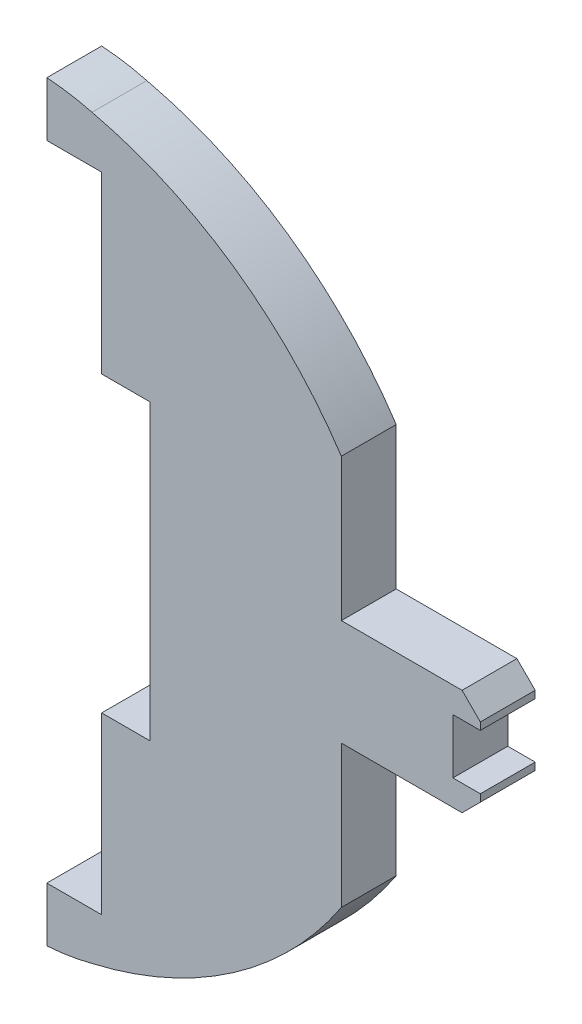
ISO-10303-21;
HEADER;
FILE_DESCRIPTION(('STEP AP214'),'2;1');
FILE_NAME('part.step','',(''),(''),'','','');
FILE_SCHEMA(('AUTOMOTIVE_DESIGN { 1 0 10303 214 1 1 1 1 }'));
ENDSEC;
DATA;
#1=APPLICATION_CONTEXT('core data for automotive mechanical design processes');
#2=APPLICATION_PROTOCOL_DEFINITION('international standard','automotive_design',2000,#1);
#3=PRODUCT_CONTEXT('',#1,'mechanical');
#4=PRODUCT('Part','Part','',(#3));
#5=PRODUCT_RELATED_PRODUCT_CATEGORY('part','',(#4));
#6=PRODUCT_DEFINITION_FORMATION('','',#4);
#7=PRODUCT_DEFINITION_CONTEXT('part definition',#1,'design');
#8=PRODUCT_DEFINITION('design','',#6,#7);
#9=PRODUCT_DEFINITION_SHAPE('','',#8);
#10=(LENGTH_UNIT() NAMED_UNIT(*) SI_UNIT(.MILLI.,.METRE.));
#11=(NAMED_UNIT(*) PLANE_ANGLE_UNIT() SI_UNIT($,.RADIAN.));
#12=(NAMED_UNIT(*) SI_UNIT($,.STERADIAN.) SOLID_ANGLE_UNIT());
#13=UNCERTAINTY_MEASURE_WITH_UNIT(LENGTH_MEASURE(1.E-05),#10,'distance_accuracy_value','');
#14=(GEOMETRIC_REPRESENTATION_CONTEXT(3) GLOBAL_UNCERTAINTY_ASSIGNED_CONTEXT((#13)) GLOBAL_UNIT_ASSIGNED_CONTEXT((#10,
#11,#12)) REPRESENTATION_CONTEXT('',''));
#15=CARTESIAN_POINT('',(0.,0.,0.));
#16=DIRECTION('',(0.,0.,1.));
#17=DIRECTION('',(1.,0.,0.));
#18=AXIS2_PLACEMENT_3D('',#15,#16,#17);
#19=CARTESIAN_POINT('',(19.5994373438194,155.602965815867,3.));
#20=DIRECTION('',(0.,0.,-1.));
#21=DIRECTION('',(-1.,0.,0.));
#22=AXIS2_PLACEMENT_3D('',#19,#20,#21);
#23=CYLINDRICAL_SURFACE('',#22,12.7681641595569);
#24=CARTESIAN_POINT('',(19.5994373438194,155.602965815867,3.));
#25=DIRECTION('',(0.,0.,1.));
#26=DIRECTION('',(1.,0.,0.));
#27=AXIS2_PLACEMENT_3D('',#24,#25,#26);
#28=CIRCLE('',#27,12.7681641595569);
#29=CARTESIAN_POINT('',(20.4107069246441,142.860601134513,3.));
#30=VERTEX_POINT('',#29);
#31=CARTESIAN_POINT('',(22.8824400958544,143.264087871114,3.));
#32=VERTEX_POINT('',#31);
#33=EDGE_CURVE('E235',#30,#32,#28,.T.);
#34=ORIENTED_EDGE('',*,*,#33,.F.);
#35=DIRECTION('',(0.,0.,-1.));
#36=VECTOR('',#35,1.);
#37=CARTESIAN_POINT('',(20.410706924644,142.860601134513,3.));
#38=LINE('',#37,#36);
#39=CARTESIAN_POINT('',(20.410706924644,142.860601134513,0.));
#40=VERTEX_POINT('',#39);
#41=EDGE_CURVE('E228',#30,#40,#38,.T.);
#42=ORIENTED_EDGE('',*,*,#41,.T.);
#43=CARTESIAN_POINT('',(19.5994373438194,155.602965815867,0.));
#44=DIRECTION('',(0.,0.,1.));
#45=DIRECTION('',(1.,0.,0.));
#46=AXIS2_PLACEMENT_3D('',#43,#44,#45);
#47=CIRCLE('',#46,12.7681641595569);
#48=CARTESIAN_POINT('',(22.8824400958544,143.264087871114,0.));
#49=VERTEX_POINT('',#48);
#50=EDGE_CURVE('E240',#40,#49,#47,.T.);
#51=ORIENTED_EDGE('',*,*,#50,.T.);
#52=DIRECTION('',(0.,0.,-1.));
#53=VECTOR('',#52,1.);
#54=CARTESIAN_POINT('',(22.8824400958544,143.264087871114,3.));
#55=LINE('',#54,#53);
#56=EDGE_CURVE('E338',#32,#49,#55,.T.);
#57=ORIENTED_EDGE('',*,*,#56,.F.);
#58=EDGE_LOOP('',(#34,#42,#51,#57));
#59=FACE_BOUND('',#58,.T.);
#60=ADVANCED_FACE('F38',(#59),#23,.T.);
#61=CARTESIAN_POINT('',(17.8149611137287,165.112045854795,3.));
#62=DIRECTION('',(0.,0.,-1.));
#63=DIRECTION('',(-1.,0.,0.));
#64=AXIS2_PLACEMENT_3D('',#61,#62,#63);
#65=CYLINDRICAL_SURFACE('',#64,22.42794264508);
#66=CARTESIAN_POINT('',(17.8149611137287,165.112045854795,0.));
#67=DIRECTION('',(0.,0.,1.));
#68=DIRECTION('',(1.,0.,0.));
#69=AXIS2_PLACEMENT_3D('',#66,#67,#68);
#70=CIRCLE('',#69,22.42794264508);
#71=CARTESIAN_POINT('',(36.517669154002,152.733785748816,0.));
#72=VERTEX_POINT('',#71);
#73=EDGE_CURVE('E248',#49,#72,#70,.T.);
#74=ORIENTED_EDGE('',*,*,#73,.T.);
#75=DIRECTION('',(0.,0.,-1.));
#76=VECTOR('',#75,1.);
#77=CARTESIAN_POINT('',(36.517669154002,152.733785748816,3.));
#78=LINE('',#77,#76);
#79=CARTESIAN_POINT('',(36.517669154002,152.733785748816,3.));
#80=VERTEX_POINT('',#79);
#81=EDGE_CURVE('E334',#80,#72,#78,.T.);
#82=ORIENTED_EDGE('',*,*,#81,.F.);
#83=CARTESIAN_POINT('',(17.8149611137287,165.112045854795,3.));
#84=DIRECTION('',(0.,0.,1.));
#85=DIRECTION('',(1.,0.,0.));
#86=AXIS2_PLACEMENT_3D('',#83,#84,#85);
#87=CIRCLE('',#86,22.42794264508);
#88=EDGE_CURVE('E394',#32,#80,#87,.T.);
#89=ORIENTED_EDGE('',*,*,#88,.F.);
#90=ORIENTED_EDGE('',*,*,#56,.T.);
#91=EDGE_LOOP('',(#74,#82,#89,#90));
#92=FACE_BOUND('',#91,.T.);
#93=ADVANCED_FACE('F444',(#92),#65,.T.);
#94=CARTESIAN_POINT('',(36.517669154002,157.325896202563,3.));
#95=DIRECTION('',(1.,0.,0.));
#96=DIRECTION('',(0.,0.,-1.));
#97=AXIS2_PLACEMENT_3D('',#94,#95,#96);
#98=PLANE('',#97);
#99=DIRECTION('',(0.,0.,1.));
#100=VECTOR('',#99,1.);
#101=CARTESIAN_POINT('',(36.517669154002,160.51800665631,-7.72787163454467));
#102=LINE('',#101,#100);
#103=CARTESIAN_POINT('',(36.517669154002,160.51800665631,0.));
#104=VERTEX_POINT('',#103);
#105=CARTESIAN_POINT('',(36.517669154002,160.51800665631,3.));
#106=VERTEX_POINT('',#105);
#107=EDGE_CURVE('E450',#104,#106,#102,.T.);
#108=ORIENTED_EDGE('',*,*,#107,.T.);
#109=DIRECTION('',(0.,-1.,0.));
#110=VECTOR('',#109,1.);
#111=CARTESIAN_POINT('',(36.517669154002,157.325896202563,3.));
#112=LINE('',#111,#110);
#113=EDGE_CURVE('E398',#106,#80,#112,.T.);
#114=ORIENTED_EDGE('',*,*,#113,.T.);
#115=ORIENTED_EDGE('',*,*,#81,.T.);
#116=DIRECTION('',(0.,-1.,0.));
#117=VECTOR('',#116,1.);
#118=CARTESIAN_POINT('',(36.517669154002,157.325896202563,0.));
#119=LINE('',#118,#117);
#120=EDGE_CURVE('E256',#104,#72,#119,.T.);
#121=ORIENTED_EDGE('',*,*,#120,.F.);
#122=EDGE_LOOP('',(#108,#114,#115,#121));
#123=FACE_BOUND('',#122,.T.);
#124=ADVANCED_FACE('F448',(#123),#98,.T.);
#125=CARTESIAN_POINT('',(36.517669154002,169.510117110058,3.));
#126=DIRECTION('',(-1.,0.,0.));
#127=DIRECTION('',(0.,0.,1.));
#128=AXIS2_PLACEMENT_3D('',#125,#126,#127);
#129=PLANE('',#128);
#130=DIRECTION('',(0.,1.,0.));
#131=VECTOR('',#130,1.);
#132=CARTESIAN_POINT('',(36.517669154002,169.510117110058,3.));
#133=LINE('',#132,#131);
#134=CARTESIAN_POINT('',(36.517669154002,166.318006656311,3.));
#135=VERTEX_POINT('',#134);
#136=CARTESIAN_POINT('',(36.517669154002,174.102227563806,3.));
#137=VERTEX_POINT('',#136);
#138=EDGE_CURVE('E400',#135,#137,#133,.T.);
#139=ORIENTED_EDGE('',*,*,#138,.F.);
#140=DIRECTION('',(0.,0.,1.));
#141=VECTOR('',#140,1.);
#142=CARTESIAN_POINT('',(36.517669154002,166.318006656311,-7.72787163454467));
#143=LINE('',#142,#141);
#144=CARTESIAN_POINT('',(36.517669154002,166.318006656311,0.));
#145=VERTEX_POINT('',#144);
#146=EDGE_CURVE('E376',#145,#135,#143,.T.);
#147=ORIENTED_EDGE('',*,*,#146,.F.);
#148=DIRECTION('',(0.,1.,0.));
#149=VECTOR('',#148,1.);
#150=CARTESIAN_POINT('',(36.517669154002,169.510117110058,0.));
#151=LINE('',#150,#149);
#152=CARTESIAN_POINT('',(36.517669154002,174.102227563806,0.));
#153=VERTEX_POINT('',#152);
#154=EDGE_CURVE('E267',#145,#153,#151,.T.);
#155=ORIENTED_EDGE('',*,*,#154,.T.);
#156=DIRECTION('',(0.,0.,-1.));
#157=VECTOR('',#156,1.);
#158=CARTESIAN_POINT('',(36.517669154002,174.102227563806,3.));
#159=LINE('',#158,#157);
#160=EDGE_CURVE('E330',#137,#153,#159,.T.);
#161=ORIENTED_EDGE('',*,*,#160,.F.);
#162=EDGE_LOOP('',(#139,#147,#155,#161));
#163=FACE_BOUND('',#162,.T.);
#164=ADVANCED_FACE('F480',(#163),#129,.F.);
#165=CARTESIAN_POINT('',(17.8149611137289,161.723967457826,3.));
#166=DIRECTION('',(0.,0.,-1.));
#167=DIRECTION('',(-1.,0.,0.));
#168=AXIS2_PLACEMENT_3D('',#165,#166,#167);
#169=CYLINDRICAL_SURFACE('',#168,22.4279426450797);
#170=CARTESIAN_POINT('',(17.8149611137289,161.723967457826,0.));
#171=DIRECTION('',(0.,0.,-1.));
#172=DIRECTION('',(1.,0.,0.));
#173=AXIS2_PLACEMENT_3D('',#170,#171,#172);
#174=CIRCLE('',#173,22.4279426450797);
#175=CARTESIAN_POINT('',(22.8824400958544,183.571925441507,0.));
#176=VERTEX_POINT('',#175);
#177=EDGE_CURVE('E270',#176,#153,#174,.T.);
#178=ORIENTED_EDGE('',*,*,#177,.F.);
#179=DIRECTION('',(0.,0.,-1.));
#180=VECTOR('',#179,1.);
#181=CARTESIAN_POINT('',(22.8824400958544,183.571925441507,3.));
#182=LINE('',#181,#180);
#183=CARTESIAN_POINT('',(22.8824400958544,183.571925441507,3.));
#184=VERTEX_POINT('',#183);
#185=EDGE_CURVE('E326',#184,#176,#182,.T.);
#186=ORIENTED_EDGE('',*,*,#185,.F.);
#187=CARTESIAN_POINT('',(17.8149611137289,161.723967457826,3.));
#188=DIRECTION('',(0.,0.,-1.));
#189=DIRECTION('',(1.,0.,0.));
#190=AXIS2_PLACEMENT_3D('',#187,#188,#189);
#191=CIRCLE('',#190,22.4279426450797);
#192=EDGE_CURVE('E403',#184,#137,#191,.T.);
#193=ORIENTED_EDGE('',*,*,#192,.T.);
#194=ORIENTED_EDGE('',*,*,#160,.T.);
#195=EDGE_LOOP('',(#178,#186,#193,#194));
#196=FACE_BOUND('',#195,.T.);
#197=ADVANCED_FACE('F484',(#196),#169,.T.);
#198=CARTESIAN_POINT('',(19.5994373438194,171.233047496754,3.));
#199=DIRECTION('',(0.,0.,-1.));
#200=DIRECTION('',(-1.,0.,0.));
#201=AXIS2_PLACEMENT_3D('',#198,#199,#200);
#202=CYLINDRICAL_SURFACE('',#201,12.7681641595569);
#203=DIRECTION('',(0.,0.,-1.));
#204=VECTOR('',#203,1.);
#205=CARTESIAN_POINT('',(20.410706924644,183.975412178108,3.));
#206=LINE('',#205,#204);
#207=CARTESIAN_POINT('',(20.4107069246441,183.975412178108,3.));
#208=VERTEX_POINT('',#207);
#209=CARTESIAN_POINT('',(20.4107069246441,183.975412178108,0.));
#210=VERTEX_POINT('',#209);
#211=EDGE_CURVE('E243',#208,#210,#206,.T.);
#212=ORIENTED_EDGE('',*,*,#211,.F.);
#213=CARTESIAN_POINT('',(19.5994373438194,171.233047496754,3.));
#214=DIRECTION('',(0.,0.,-1.));
#215=DIRECTION('',(1.,0.,0.));
#216=AXIS2_PLACEMENT_3D('',#213,#214,#215);
#217=CIRCLE('',#216,12.7681641595569);
#218=EDGE_CURVE('E407',#208,#184,#217,.T.);
#219=ORIENTED_EDGE('',*,*,#218,.T.);
#220=ORIENTED_EDGE('',*,*,#185,.T.);
#221=CARTESIAN_POINT('',(19.5994373438194,171.233047496754,0.));
#222=DIRECTION('',(0.,0.,-1.));
#223=DIRECTION('',(1.,0.,0.));
#224=AXIS2_PLACEMENT_3D('',#221,#222,#223);
#225=CIRCLE('',#224,12.7681641595569);
#226=EDGE_CURVE('E274',#210,#176,#225,.T.);
#227=ORIENTED_EDGE('',*,*,#226,.F.);
#228=EDGE_LOOP('',(#212,#219,#220,#227));
#229=FACE_BOUND('',#228,.T.);
#230=ADVANCED_FACE('F488',(#229),#202,.T.);
#231=CARTESIAN_POINT('',(20.410706924644,181.639203910361,3.));
#232=DIRECTION('',(-1.,0.,0.));
#233=DIRECTION('',(0.,0.,1.));
#234=AXIS2_PLACEMENT_3D('',#231,#232,#233);
#235=PLANE('',#234);
#236=DIRECTION('',(0.,1.,0.));
#237=VECTOR('',#236,1.);
#238=CARTESIAN_POINT('',(20.410706924644,181.639203910361,0.));
#239=LINE('',#238,#237);
#240=CARTESIAN_POINT('',(20.410706924644,181.00121165631,0.));
#241=VERTEX_POINT('',#240);
#242=EDGE_CURVE('E53',#241,#210,#239,.T.);
#243=ORIENTED_EDGE('',*,*,#242,.F.);
#244=DIRECTION('',(0.,0.,-1.));
#245=VECTOR('',#244,1.);
#246=CARTESIAN_POINT('',(20.410706924644,181.00121165631,3.));
#247=LINE('',#246,#245);
#248=CARTESIAN_POINT('',(20.410706924644,181.00121165631,3.));
#249=VERTEX_POINT('',#248);
#250=EDGE_CURVE('E323',#249,#241,#247,.T.);
#251=ORIENTED_EDGE('',*,*,#250,.F.);
#252=DIRECTION('',(0.,1.,0.));
#253=VECTOR('',#252,1.);
#254=CARTESIAN_POINT('',(20.410706924644,181.639203910361,3.));
#255=LINE('',#254,#253);
#256=EDGE_CURVE('E410',#249,#208,#255,.T.);
#257=ORIENTED_EDGE('',*,*,#256,.T.);
#258=ORIENTED_EDGE('',*,*,#211,.T.);
#259=EDGE_LOOP('',(#243,#251,#257,#258));
#260=FACE_BOUND('',#259,.T.);
#261=ADVANCED_FACE('F558',(#260),#235,.T.);
#262=CARTESIAN_POINT('',(21.910706924644,181.00121165631,3.));
#263=DIRECTION('',(0.,-1.,0.));
#264=DIRECTION('',(0.,0.,-1.));
#265=AXIS2_PLACEMENT_3D('',#262,#263,#264);
#266=PLANE('',#265);
#267=DIRECTION('',(-1.,0.,0.));
#268=VECTOR('',#267,1.);
#269=CARTESIAN_POINT('',(21.910706924644,181.00121165631,0.));
#270=LINE('',#269,#268);
#271=CARTESIAN_POINT('',(23.4107069246441,181.00121165631,0.));
#272=VERTEX_POINT('',#271);
#273=EDGE_CURVE('E278',#272,#241,#270,.T.);
#274=ORIENTED_EDGE('',*,*,#273,.F.);
#275=DIRECTION('',(0.,0.,-1.));
#276=VECTOR('',#275,1.);
#277=CARTESIAN_POINT('',(23.4107069246441,181.00121165631,3.));
#278=LINE('',#277,#276);
#279=CARTESIAN_POINT('',(23.4107069246441,181.00121165631,3.));
#280=VERTEX_POINT('',#279);
#281=EDGE_CURVE('E320',#280,#272,#278,.T.);
#282=ORIENTED_EDGE('',*,*,#281,.F.);
#283=DIRECTION('',(-1.,0.,0.));
#284=VECTOR('',#283,1.);
#285=CARTESIAN_POINT('',(21.910706924644,181.00121165631,3.));
#286=LINE('',#285,#284);
#287=EDGE_CURVE('E413',#280,#249,#286,.T.);
#288=ORIENTED_EDGE('',*,*,#287,.T.);
#289=ORIENTED_EDGE('',*,*,#250,.T.);
#290=EDGE_LOOP('',(#274,#282,#288,#289));
#291=FACE_BOUND('',#290,.T.);
#292=ADVANCED_FACE('F495',(#291),#266,.T.);
#293=CARTESIAN_POINT('',(23.4107069246441,176.221740571835,3.));
#294=DIRECTION('',(-1.,0.,0.));
#295=DIRECTION('',(0.,-1.,0.));
#296=AXIS2_PLACEMENT_3D('',#293,#294,#295);
#297=PLANE('',#296);
#298=DIRECTION('',(0.,1.,0.));
#299=VECTOR('',#298,1.);
#300=CARTESIAN_POINT('',(23.4107069246441,176.221740571835,0.));
#301=LINE('',#300,#299);
#302=CARTESIAN_POINT('',(23.4107069246441,171.44226948736,0.));
#303=VERTEX_POINT('',#302);
#304=EDGE_CURVE('E281',#303,#272,#301,.T.);
#305=ORIENTED_EDGE('',*,*,#304,.F.);
#306=DIRECTION('',(0.,0.,-1.));
#307=VECTOR('',#306,1.);
#308=CARTESIAN_POINT('',(23.4107069246441,171.44226948736,3.));
#309=LINE('',#308,#307);
#310=CARTESIAN_POINT('',(23.4107069246441,171.44226948736,3.));
#311=VERTEX_POINT('',#310);
#312=EDGE_CURVE('E317',#311,#303,#309,.T.);
#313=ORIENTED_EDGE('',*,*,#312,.F.);
#314=DIRECTION('',(0.,1.,0.));
#315=VECTOR('',#314,1.);
#316=CARTESIAN_POINT('',(23.4107069246441,176.221740571835,3.));
#317=LINE('',#316,#315);
#318=EDGE_CURVE('E417',#311,#280,#317,.T.);
#319=ORIENTED_EDGE('',*,*,#318,.T.);
#320=ORIENTED_EDGE('',*,*,#281,.T.);
#321=EDGE_LOOP('',(#305,#313,#319,#320));
#322=FACE_BOUND('',#321,.T.);
#323=ADVANCED_FACE('F498',(#322),#297,.T.);
#324=CARTESIAN_POINT('',(24.7319479659402,171.44226948736,3.));
#325=DIRECTION('',(0.,-1.,0.));
#326=DIRECTION('',(0.,0.,-1.));
#327=AXIS2_PLACEMENT_3D('',#324,#325,#326);
#328=PLANE('',#327);
#329=DIRECTION('',(-1.,0.,0.));
#330=VECTOR('',#329,1.);
#331=CARTESIAN_POINT('',(24.7319479659402,171.44226948736,0.));
#332=LINE('',#331,#330);
#333=CARTESIAN_POINT('',(26.0531890072364,171.44226948736,0.));
#334=VERTEX_POINT('',#333);
#335=EDGE_CURVE('E285',#334,#303,#332,.T.);
#336=ORIENTED_EDGE('',*,*,#335,.F.);
#337=DIRECTION('',(0.,0.,-1.));
#338=VECTOR('',#337,1.);
#339=CARTESIAN_POINT('',(26.0531890072364,171.44226948736,3.));
#340=LINE('',#339,#338);
#341=CARTESIAN_POINT('',(26.0531890072364,171.44226948736,3.));
#342=VERTEX_POINT('',#341);
#343=EDGE_CURVE('E314',#342,#334,#340,.T.);
#344=ORIENTED_EDGE('',*,*,#343,.F.);
#345=DIRECTION('',(-1.,0.,0.));
#346=VECTOR('',#345,1.);
#347=CARTESIAN_POINT('',(24.7319479659402,171.44226948736,3.));
#348=LINE('',#347,#346);
#349=EDGE_CURVE('E421',#342,#311,#348,.T.);
#350=ORIENTED_EDGE('',*,*,#349,.T.);
#351=ORIENTED_EDGE('',*,*,#312,.T.);
#352=EDGE_LOOP('',(#336,#344,#350,#351));
#353=FACE_BOUND('',#352,.T.);
#354=ADVANCED_FACE('F503',(#353),#328,.T.);
#355=CARTESIAN_POINT('',(26.0531890072364,167.430138071835,3.));
#356=DIRECTION('',(-1.,0.,0.));
#357=DIRECTION('',(0.,0.,1.));
#358=AXIS2_PLACEMENT_3D('',#355,#356,#357);
#359=PLANE('',#358);
#360=DIRECTION('',(0.,1.,0.));
#361=VECTOR('',#360,1.);
#362=CARTESIAN_POINT('',(26.0531890072364,167.430138071835,0.));
#363=LINE('',#362,#361);
#364=CARTESIAN_POINT('',(26.0531890072364,155.393743825262,0.));
#365=VERTEX_POINT('',#364);
#366=EDGE_CURVE('E289',#365,#334,#363,.T.);
#367=ORIENTED_EDGE('',*,*,#366,.F.);
#368=DIRECTION('',(0.,0.,-1.));
#369=VECTOR('',#368,1.);
#370=CARTESIAN_POINT('',(26.0531890072364,155.393743825262,3.));
#371=LINE('',#370,#369);
#372=CARTESIAN_POINT('',(26.0531890072364,155.393743825262,3.));
#373=VERTEX_POINT('',#372);
#374=EDGE_CURVE('E311',#373,#365,#371,.T.);
#375=ORIENTED_EDGE('',*,*,#374,.F.);
#376=DIRECTION('',(0.,1.,0.));
#377=VECTOR('',#376,1.);
#378=CARTESIAN_POINT('',(26.0531890072364,167.430138071835,3.));
#379=LINE('',#378,#377);
#380=EDGE_CURVE('E425',#373,#342,#379,.T.);
#381=ORIENTED_EDGE('',*,*,#380,.T.);
#382=ORIENTED_EDGE('',*,*,#343,.T.);
#383=EDGE_LOOP('',(#367,#375,#381,#382));
#384=FACE_BOUND('',#383,.T.);
#385=ADVANCED_FACE('F506',(#384),#359,.T.);
#386=CARTESIAN_POINT('',(24.7319479659402,155.393743825262,3.));
#387=DIRECTION('',(0.,-1.,0.));
#388=DIRECTION('',(0.,0.,-1.));
#389=AXIS2_PLACEMENT_3D('',#386,#387,#388);
#390=PLANE('',#389);
#391=DIRECTION('',(-1.,0.,0.));
#392=VECTOR('',#391,1.);
#393=CARTESIAN_POINT('',(24.7319479659402,155.393743825262,0.));
#394=LINE('',#393,#392);
#395=CARTESIAN_POINT('',(23.4107069246441,155.393743825262,0.));
#396=VERTEX_POINT('',#395);
#397=EDGE_CURVE('E293',#365,#396,#394,.T.);
#398=ORIENTED_EDGE('',*,*,#397,.T.);
#399=DIRECTION('',(0.,0.,-1.));
#400=VECTOR('',#399,1.);
#401=CARTESIAN_POINT('',(23.4107069246441,155.393743825262,3.));
#402=LINE('',#401,#400);
#403=CARTESIAN_POINT('',(23.4107069246441,155.393743825262,3.));
#404=VERTEX_POINT('',#403);
#405=EDGE_CURVE('E307',#404,#396,#402,.T.);
#406=ORIENTED_EDGE('',*,*,#405,.F.);
#407=DIRECTION('',(-1.,0.,0.));
#408=VECTOR('',#407,1.);
#409=CARTESIAN_POINT('',(24.7319479659402,155.393743825262,3.));
#410=LINE('',#409,#408);
#411=EDGE_CURVE('E429',#373,#404,#410,.T.);
#412=ORIENTED_EDGE('',*,*,#411,.F.);
#413=ORIENTED_EDGE('',*,*,#374,.T.);
#414=EDGE_LOOP('',(#398,#406,#412,#413));
#415=FACE_BOUND('',#414,.T.);
#416=ADVANCED_FACE('F512',(#415),#390,.F.);
#417=CARTESIAN_POINT('',(23.4107069246441,150.614272740786,3.));
#418=DIRECTION('',(1.,0.,0.));
#419=DIRECTION('',(0.,0.,-1.));
#420=AXIS2_PLACEMENT_3D('',#417,#418,#419);
#421=PLANE('',#420);
#422=DIRECTION('',(0.,-1.,0.));
#423=VECTOR('',#422,1.);
#424=CARTESIAN_POINT('',(23.4107069246441,150.614272740786,0.));
#425=LINE('',#424,#423);
#426=CARTESIAN_POINT('',(23.4107069246441,145.834801656311,0.));
#427=VERTEX_POINT('',#426);
#428=EDGE_CURVE('E296',#396,#427,#425,.T.);
#429=ORIENTED_EDGE('',*,*,#428,.T.);
#430=DIRECTION('',(0.,0.,-1.));
#431=VECTOR('',#430,1.);
#432=CARTESIAN_POINT('',(23.4107069246441,145.834801656311,3.));
#433=LINE('',#432,#431);
#434=CARTESIAN_POINT('',(23.4107069246441,145.834801656311,3.));
#435=VERTEX_POINT('',#434);
#436=EDGE_CURVE('E303',#435,#427,#433,.T.);
#437=ORIENTED_EDGE('',*,*,#436,.F.);
#438=DIRECTION('',(0.,-1.,0.));
#439=VECTOR('',#438,1.);
#440=CARTESIAN_POINT('',(23.4107069246441,150.614272740786,3.));
#441=LINE('',#440,#439);
#442=EDGE_CURVE('E432',#404,#435,#441,.T.);
#443=ORIENTED_EDGE('',*,*,#442,.F.);
#444=ORIENTED_EDGE('',*,*,#405,.T.);
#445=EDGE_LOOP('',(#429,#437,#443,#444));
#446=FACE_BOUND('',#445,.T.);
#447=ADVANCED_FACE('F516',(#446),#421,.F.);
#448=CARTESIAN_POINT('',(21.910706924644,145.834801656311,3.));
#449=DIRECTION('',(0.,-1.,0.));
#450=DIRECTION('',(0.,0.,-1.));
#451=AXIS2_PLACEMENT_3D('',#448,#449,#450);
#452=PLANE('',#451);
#453=DIRECTION('',(-1.,0.,0.));
#454=VECTOR('',#453,1.);
#455=CARTESIAN_POINT('',(21.910706924644,145.834801656311,0.));
#456=LINE('',#455,#454);
#457=CARTESIAN_POINT('',(20.410706924644,145.834801656311,0.));
#458=VERTEX_POINT('',#457);
#459=EDGE_CURVE('E236',#427,#458,#456,.T.);
#460=ORIENTED_EDGE('',*,*,#459,.T.);
#461=DIRECTION('',(0.,0.,-1.));
#462=VECTOR('',#461,1.);
#463=CARTESIAN_POINT('',(20.410706924644,145.834801656311,3.));
#464=LINE('',#463,#462);
#465=CARTESIAN_POINT('',(20.410706924644,145.834801656311,3.));
#466=VERTEX_POINT('',#465);
#467=EDGE_CURVE('E231',#466,#458,#464,.T.);
#468=ORIENTED_EDGE('',*,*,#467,.F.);
#469=DIRECTION('',(-1.,0.,0.));
#470=VECTOR('',#469,1.);
#471=CARTESIAN_POINT('',(21.910706924644,145.834801656311,3.));
#472=LINE('',#471,#470);
#473=EDGE_CURVE('E434',#435,#466,#472,.T.);
#474=ORIENTED_EDGE('',*,*,#473,.F.);
#475=ORIENTED_EDGE('',*,*,#436,.T.);
#476=EDGE_LOOP('',(#460,#468,#474,#475));
#477=FACE_BOUND('',#476,.T.);
#478=ADVANCED_FACE('F518',(#477),#452,.F.);
#479=CARTESIAN_POINT('',(20.410706924644,145.19680940226,3.));
#480=DIRECTION('',(1.,0.,0.));
#481=DIRECTION('',(0.,0.,-1.));
#482=AXIS2_PLACEMENT_3D('',#479,#480,#481);
#483=PLANE('',#482);
#484=DIRECTION('',(0.,-1.,0.));
#485=VECTOR('',#484,1.);
#486=CARTESIAN_POINT('',(20.410706924644,145.19680940226,0.));
#487=LINE('',#486,#485);
#488=EDGE_CURVE('E224',#458,#40,#487,.T.);
#489=ORIENTED_EDGE('',*,*,#488,.T.);
#490=ORIENTED_EDGE('',*,*,#41,.F.);
#491=DIRECTION('',(0.,-1.,0.));
#492=VECTOR('',#491,1.);
#493=CARTESIAN_POINT('',(20.410706924644,145.19680940226,3.));
#494=LINE('',#493,#492);
#495=EDGE_CURVE('E262',#466,#30,#494,.T.);
#496=ORIENTED_EDGE('',*,*,#495,.F.);
#497=ORIENTED_EDGE('',*,*,#467,.T.);
#498=EDGE_LOOP('',(#489,#490,#496,#497));
#499=FACE_BOUND('',#498,.T.);
#500=ADVANCED_FACE('F226',(#499),#483,.F.);
#501=CARTESIAN_POINT('',(221.883213984944,-32.3050135869362,3.));
#502=DIRECTION('',(0.,0.,1.));
#503=DIRECTION('',(1.,0.,0.));
#504=AXIS2_PLACEMENT_3D('',#501,#502,#503);
#505=PLANE('',#504);
#506=ORIENTED_EDGE('',*,*,#495,.T.);
#507=ORIENTED_EDGE('',*,*,#33,.T.);
#508=ORIENTED_EDGE('',*,*,#88,.T.);
#509=ORIENTED_EDGE('',*,*,#113,.F.);
#510=DIRECTION('',(1.,0.,0.));
#511=VECTOR('',#510,1.);
#512=CARTESIAN_POINT('',(36.517669154002,160.51800665631,3.));
#513=LINE('',#512,#511);
#514=CARTESIAN_POINT('',(43.117669154002,160.51800665631,3.));
#515=VERTEX_POINT('',#514);
#516=EDGE_CURVE('E242',#106,#515,#513,.T.);
#517=ORIENTED_EDGE('',*,*,#516,.T.);
#518=DIRECTION('',(-0.70710678118654,-0.707106781186555,0.));
#519=VECTOR('',#518,1.);
#520=CARTESIAN_POINT('',(36.0889314478478,153.489268950156,3.));
#521=LINE('',#520,#519);
#522=CARTESIAN_POINT('',(44.1176691540021,161.518006656311,3.));
#523=VERTEX_POINT('',#522);
#524=EDGE_CURVE('E346',#515,#523,#521,.F.);
#525=ORIENTED_EDGE('',*,*,#524,.T.);
#526=DIRECTION('',(0.,1.,0.));
#527=VECTOR('',#526,1.);
#528=CARTESIAN_POINT('',(44.1176691540021,161.91800665631,3.));
#529=LINE('',#528,#527);
#530=CARTESIAN_POINT('',(44.1176691540021,161.91800665631,3.));
#531=VERTEX_POINT('',#530);
#532=EDGE_CURVE('E454',#523,#531,#529,.T.);
#533=ORIENTED_EDGE('',*,*,#532,.T.);
#534=DIRECTION('',(-1.,0.,0.));
#535=VECTOR('',#534,1.);
#536=CARTESIAN_POINT('',(36.517669154002,161.91800665631,3.));
#537=LINE('',#536,#535);
#538=CARTESIAN_POINT('',(42.6176691540021,161.91800665631,3.));
#539=VERTEX_POINT('',#538);
#540=EDGE_CURVE('E456',#531,#539,#537,.T.);
#541=ORIENTED_EDGE('',*,*,#540,.T.);
#542=DIRECTION('',(0.,-1.,0.));
#543=VECTOR('',#542,1.);
#544=CARTESIAN_POINT('',(42.6176691540021,164.918006656311,3.));
#545=LINE('',#544,#543);
#546=CARTESIAN_POINT('',(42.6176691540021,164.918006656311,3.));
#547=VERTEX_POINT('',#546);
#548=EDGE_CURVE('E250',#547,#539,#545,.T.);
#549=ORIENTED_EDGE('',*,*,#548,.F.);
#550=DIRECTION('',(1.,0.,0.));
#551=VECTOR('',#550,1.);
#552=CARTESIAN_POINT('',(36.517669154002,164.918006656311,3.));
#553=LINE('',#552,#551);
#554=CARTESIAN_POINT('',(44.1176691540021,164.918006656311,3.));
#555=VERTEX_POINT('',#554);
#556=EDGE_CURVE('E366',#547,#555,#553,.T.);
#557=ORIENTED_EDGE('',*,*,#556,.T.);
#558=DIRECTION('',(0.,1.,0.));
#559=VECTOR('',#558,1.);
#560=CARTESIAN_POINT('',(44.1176691540021,166.318006656311,3.));
#561=LINE('',#560,#559);
#562=CARTESIAN_POINT('',(44.1176691540021,165.318006656311,3.));
#563=VERTEX_POINT('',#562);
#564=EDGE_CURVE('E359',#555,#563,#561,.T.);
#565=ORIENTED_EDGE('',*,*,#564,.T.);
#566=DIRECTION('',(0.707106781186543,-0.707106781186552,0.));
#567=VECTOR('',#566,1.);
#568=CARTESIAN_POINT('',(231.811951691095,-22.3762758807851,3.));
#569=LINE('',#568,#567);
#570=CARTESIAN_POINT('',(43.1176691540021,166.318006656311,3.));
#571=VERTEX_POINT('',#570);
#572=EDGE_CURVE('E344',#563,#571,#569,.F.);
#573=ORIENTED_EDGE('',*,*,#572,.T.);
#574=DIRECTION('',(-1.,0.,0.));
#575=VECTOR('',#574,1.);
#576=CARTESIAN_POINT('',(36.517669154002,166.318006656311,3.));
#577=LINE('',#576,#575);
#578=EDGE_CURVE('E368',#571,#135,#577,.T.);
#579=ORIENTED_EDGE('',*,*,#578,.T.);
#580=ORIENTED_EDGE('',*,*,#138,.T.);
#581=ORIENTED_EDGE('',*,*,#192,.F.);
#582=ORIENTED_EDGE('',*,*,#218,.F.);
#583=ORIENTED_EDGE('',*,*,#256,.F.);
#584=ORIENTED_EDGE('',*,*,#287,.F.);
#585=ORIENTED_EDGE('',*,*,#318,.F.);
#586=ORIENTED_EDGE('',*,*,#349,.F.);
#587=ORIENTED_EDGE('',*,*,#380,.F.);
#588=ORIENTED_EDGE('',*,*,#411,.T.);
#589=ORIENTED_EDGE('',*,*,#442,.T.);
#590=ORIENTED_EDGE('',*,*,#473,.T.);
#591=EDGE_LOOP('',(#506,#507,#508,#509,#517,#525,#533,#541,#549,#557,#565,#573,#579,#580,#581,
#582,#583,#584,#585,#586,#587,#588,#589,#590));
#592=FACE_BOUND('',#591,.T.);
#593=ADVANCED_FACE('F363',(#592),#505,.T.);
#594=CARTESIAN_POINT('',(221.883213984944,-32.3050135869362,0.));
#595=DIRECTION('',(0.,0.,1.));
#596=DIRECTION('',(1.,0.,0.));
#597=AXIS2_PLACEMENT_3D('',#594,#595,#596);
#598=PLANE('',#597);
#599=ORIENTED_EDGE('',*,*,#50,.F.);
#600=ORIENTED_EDGE('',*,*,#488,.F.);
#601=ORIENTED_EDGE('',*,*,#459,.F.);
#602=ORIENTED_EDGE('',*,*,#428,.F.);
#603=ORIENTED_EDGE('',*,*,#397,.F.);
#604=ORIENTED_EDGE('',*,*,#366,.T.);
#605=ORIENTED_EDGE('',*,*,#335,.T.);
#606=ORIENTED_EDGE('',*,*,#304,.T.);
#607=ORIENTED_EDGE('',*,*,#273,.T.);
#608=ORIENTED_EDGE('',*,*,#242,.T.);
#609=ORIENTED_EDGE('',*,*,#226,.T.);
#610=ORIENTED_EDGE('',*,*,#177,.T.);
#611=ORIENTED_EDGE('',*,*,#154,.F.);
#612=DIRECTION('',(1.,0.,0.));
#613=VECTOR('',#612,1.);
#614=CARTESIAN_POINT('',(36.517669154002,166.318006656311,0.));
#615=LINE('',#614,#613);
#616=CARTESIAN_POINT('',(43.1176691540021,166.318006656311,0.));
#617=VERTEX_POINT('',#616);
#618=EDGE_CURVE('E384',#145,#617,#615,.T.);
#619=ORIENTED_EDGE('',*,*,#618,.T.);
#620=DIRECTION('',(-0.707106781186543,0.707106781186552,0.));
#621=VECTOR('',#620,1.);
#622=CARTESIAN_POINT('',(44.1176691540021,165.318006656311,0.));
#623=LINE('',#622,#621);
#624=CARTESIAN_POINT('',(44.1176691540021,165.318006656311,0.));
#625=VERTEX_POINT('',#624);
#626=EDGE_CURVE('E60',#617,#625,#623,.F.);
#627=ORIENTED_EDGE('',*,*,#626,.T.);
#628=DIRECTION('',(0.,-1.,0.));
#629=VECTOR('',#628,1.);
#630=CARTESIAN_POINT('',(44.1176691540021,166.318006656311,0.));
#631=LINE('',#630,#629);
#632=CARTESIAN_POINT('',(44.1176691540021,164.918006656311,0.));
#633=VERTEX_POINT('',#632);
#634=EDGE_CURVE('E360',#625,#633,#631,.T.);
#635=ORIENTED_EDGE('',*,*,#634,.T.);
#636=DIRECTION('',(-1.,0.,0.));
#637=VECTOR('',#636,1.);
#638=CARTESIAN_POINT('',(36.517669154002,164.918006656311,0.));
#639=LINE('',#638,#637);
#640=CARTESIAN_POINT('',(42.6176691540021,164.918006656311,0.));
#641=VERTEX_POINT('',#640);
#642=EDGE_CURVE('E380',#633,#641,#639,.T.);
#643=ORIENTED_EDGE('',*,*,#642,.T.);
#644=DIRECTION('',(0.,1.,0.));
#645=VECTOR('',#644,1.);
#646=CARTESIAN_POINT('',(42.6176691540021,161.91800665631,0.));
#647=LINE('',#646,#645);
#648=CARTESIAN_POINT('',(42.6176691540021,161.91800665631,0.));
#649=VERTEX_POINT('',#648);
#650=EDGE_CURVE('E387',#649,#641,#647,.T.);
#651=ORIENTED_EDGE('',*,*,#650,.F.);
#652=DIRECTION('',(1.,0.,0.));
#653=VECTOR('',#652,1.);
#654=CARTESIAN_POINT('',(36.517669154002,161.91800665631,0.));
#655=LINE('',#654,#653);
#656=CARTESIAN_POINT('',(44.1176691540021,161.91800665631,0.));
#657=VERTEX_POINT('',#656);
#658=EDGE_CURVE('E459',#649,#657,#655,.T.);
#659=ORIENTED_EDGE('',*,*,#658,.T.);
#660=DIRECTION('',(0.,-1.,0.));
#661=VECTOR('',#660,1.);
#662=CARTESIAN_POINT('',(44.1176691540021,161.91800665631,0.));
#663=LINE('',#662,#661);
#664=CARTESIAN_POINT('',(44.1176691540021,161.518006656311,0.));
#665=VERTEX_POINT('',#664);
#666=EDGE_CURVE('E467',#657,#665,#663,.T.);
#667=ORIENTED_EDGE('',*,*,#666,.T.);
#668=DIRECTION('',(0.70710678118654,0.707106781186555,0.));
#669=VECTOR('',#668,1.);
#670=CARTESIAN_POINT('',(43.117669154002,160.51800665631,0.));
#671=LINE('',#670,#669);
#672=CARTESIAN_POINT('',(43.117669154002,160.51800665631,0.));
#673=VERTEX_POINT('',#672);
#674=EDGE_CURVE('E351',#665,#673,#671,.F.);
#675=ORIENTED_EDGE('',*,*,#674,.T.);
#676=DIRECTION('',(-1.,0.,0.));
#677=VECTOR('',#676,1.);
#678=CARTESIAN_POINT('',(36.517669154002,160.51800665631,0.));
#679=LINE('',#678,#677);
#680=EDGE_CURVE('E372',#673,#104,#679,.T.);
#681=ORIENTED_EDGE('',*,*,#680,.T.);
#682=ORIENTED_EDGE('',*,*,#120,.T.);
#683=ORIENTED_EDGE('',*,*,#73,.F.);
#684=EDGE_LOOP('',(#599,#600,#601,#602,#603,#604,#605,#606,#607,#608,#609,#610,#611,#619,#627,
#635,#643,#651,#659,#667,#675,#681,#682,#683));
#685=FACE_BOUND('',#684,.T.);
#686=ADVANCED_FACE('F246',(#685),#598,.F.);
#687=CARTESIAN_POINT('',(42.6176691540021,0.,0.));
#688=DIRECTION('',(1.,0.,0.));
#689=DIRECTION('',(0.,0.,-1.));
#690=AXIS2_PLACEMENT_3D('',#687,#688,#689);
#691=PLANE('',#690);
#692=DIRECTION('',(0.,0.,-1.));
#693=VECTOR('',#692,1.);
#694=CARTESIAN_POINT('',(42.6176691540021,161.91800665631,3.));
#695=LINE('',#694,#693);
#696=EDGE_CURVE('E383',#539,#649,#695,.T.);
#697=ORIENTED_EDGE('',*,*,#696,.T.);
#698=ORIENTED_EDGE('',*,*,#650,.T.);
#699=DIRECTION('',(0.,0.,1.));
#700=VECTOR('',#699,1.);
#701=CARTESIAN_POINT('',(42.6176691540021,164.918006656311,0.));
#702=LINE('',#701,#700);
#703=EDGE_CURVE('E259',#641,#547,#702,.T.);
#704=ORIENTED_EDGE('',*,*,#703,.T.);
#705=ORIENTED_EDGE('',*,*,#548,.T.);
#706=EDGE_LOOP('',(#697,#698,#704,#705));
#707=FACE_BOUND('',#706,.T.);
#708=ADVANCED_FACE('F586',(#707),#691,.T.);
#709=CARTESIAN_POINT('',(36.517669154002,166.318006656311,-7.72787163454467));
#710=DIRECTION('',(0.,1.,0.));
#711=DIRECTION('',(0.,0.,1.));
#712=AXIS2_PLACEMENT_3D('',#709,#710,#711);
#713=PLANE('',#712);
#714=ORIENTED_EDGE('',*,*,#578,.F.);
#715=DIRECTION('',(0.,0.,-1.));
#716=VECTOR('',#715,1.);
#717=CARTESIAN_POINT('',(43.1176691540021,166.318006656311,-7.72787163454467));
#718=LINE('',#717,#716);
#719=EDGE_CURVE('E11',#571,#617,#718,.T.);
#720=ORIENTED_EDGE('',*,*,#719,.T.);
#721=ORIENTED_EDGE('',*,*,#618,.F.);
#722=ORIENTED_EDGE('',*,*,#146,.T.);
#723=EDGE_LOOP('',(#714,#720,#721,#722));
#724=FACE_BOUND('',#723,.T.);
#725=ADVANCED_FACE('F474',(#724),#713,.T.);
#726=CARTESIAN_POINT('',(44.1176691540021,166.318006656311,-7.72787163454467));
#727=DIRECTION('',(1.,0.,0.));
#728=DIRECTION('',(0.,0.,-1.));
#729=AXIS2_PLACEMENT_3D('',#726,#727,#728);
#730=PLANE('',#729);
#731=ORIENTED_EDGE('',*,*,#634,.F.);
#732=DIRECTION('',(0.,0.,1.));
#733=VECTOR('',#732,1.);
#734=CARTESIAN_POINT('',(44.1176691540021,165.318006656311,-7.72787163454467));
#735=LINE('',#734,#733);
#736=EDGE_CURVE('E46',#625,#563,#735,.T.);
#737=ORIENTED_EDGE('',*,*,#736,.T.);
#738=ORIENTED_EDGE('',*,*,#564,.F.);
#739=DIRECTION('',(0.,0.,1.));
#740=VECTOR('',#739,1.);
#741=CARTESIAN_POINT('',(44.1176691540021,164.918006656311,-7.72787163454467));
#742=LINE('',#741,#740);
#743=EDGE_CURVE('E370',#633,#555,#742,.T.);
#744=ORIENTED_EDGE('',*,*,#743,.F.);
#745=EDGE_LOOP('',(#731,#737,#738,#744));
#746=FACE_BOUND('',#745,.T.);
#747=ADVANCED_FACE('F357',(#746),#730,.T.);
#748=CARTESIAN_POINT('',(36.517669154002,164.918006656311,-7.72787163454467));
#749=DIRECTION('',(0.,-1.,0.));
#750=DIRECTION('',(0.,0.,-1.));
#751=AXIS2_PLACEMENT_3D('',#748,#749,#750);
#752=PLANE('',#751);
#753=ORIENTED_EDGE('',*,*,#556,.F.);
#754=ORIENTED_EDGE('',*,*,#703,.F.);
#755=ORIENTED_EDGE('',*,*,#642,.F.);
#756=ORIENTED_EDGE('',*,*,#743,.T.);
#757=EDGE_LOOP('',(#753,#754,#755,#756));
#758=FACE_BOUND('',#757,.T.);
#759=ADVANCED_FACE('F600',(#758),#752,.T.);
#760=CARTESIAN_POINT('',(36.517669154002,161.91800665631,-7.72787163454467));
#761=DIRECTION('',(0.,1.,0.));
#762=DIRECTION('',(0.,0.,1.));
#763=AXIS2_PLACEMENT_3D('',#760,#761,#762);
#764=PLANE('',#763);
#765=ORIENTED_EDGE('',*,*,#658,.F.);
#766=ORIENTED_EDGE('',*,*,#696,.F.);
#767=ORIENTED_EDGE('',*,*,#540,.F.);
#768=DIRECTION('',(0.,0.,1.));
#769=VECTOR('',#768,1.);
#770=CARTESIAN_POINT('',(44.1176691540021,161.91800665631,-7.72787163454467));
#771=LINE('',#770,#769);
#772=EDGE_CURVE('E464',#657,#531,#771,.T.);
#773=ORIENTED_EDGE('',*,*,#772,.F.);
#774=EDGE_LOOP('',(#765,#766,#767,#773));
#775=FACE_BOUND('',#774,.T.);
#776=ADVANCED_FACE('F605',(#775),#764,.T.);
#777=CARTESIAN_POINT('',(44.1176691540021,161.91800665631,-7.72787163454467));
#778=DIRECTION('',(1.,0.,0.));
#779=DIRECTION('',(0.,0.,-1.));
#780=AXIS2_PLACEMENT_3D('',#777,#778,#779);
#781=PLANE('',#780);
#782=ORIENTED_EDGE('',*,*,#532,.F.);
#783=DIRECTION('',(0.,0.,-1.));
#784=VECTOR('',#783,1.);
#785=CARTESIAN_POINT('',(44.1176691540021,161.518006656311,-7.72787163454467));
#786=LINE('',#785,#784);
#787=EDGE_CURVE('E348',#523,#665,#786,.T.);
#788=ORIENTED_EDGE('',*,*,#787,.T.);
#789=ORIENTED_EDGE('',*,*,#666,.F.);
#790=ORIENTED_EDGE('',*,*,#772,.T.);
#791=EDGE_LOOP('',(#782,#788,#789,#790));
#792=FACE_BOUND('',#791,.T.);
#793=ADVANCED_FACE('F546',(#792),#781,.T.);
#794=CARTESIAN_POINT('',(36.517669154002,160.51800665631,-7.72787163454467));
#795=DIRECTION('',(0.,-1.,0.));
#796=DIRECTION('',(0.,0.,-1.));
#797=AXIS2_PLACEMENT_3D('',#794,#795,#796);
#798=PLANE('',#797);
#799=ORIENTED_EDGE('',*,*,#680,.F.);
#800=DIRECTION('',(0.,0.,1.));
#801=VECTOR('',#800,1.);
#802=CARTESIAN_POINT('',(43.117669154002,160.51800665631,-7.72787163454467));
#803=LINE('',#802,#801);
#804=EDGE_CURVE('E341',#673,#515,#803,.T.);
#805=ORIENTED_EDGE('',*,*,#804,.T.);
#806=ORIENTED_EDGE('',*,*,#516,.F.);
#807=ORIENTED_EDGE('',*,*,#107,.F.);
#808=EDGE_LOOP('',(#799,#805,#806,#807));
#809=FACE_BOUND('',#808,.T.);
#810=ADVANCED_FACE('F540',(#809),#798,.T.);
#811=CARTESIAN_POINT('',(43.117669154002,160.51800665631,-7.72787163454467));
#812=DIRECTION('',(-0.707106781186555,0.70710678118654,0.));
#813=DIRECTION('',(0.,0.,1.));
#814=AXIS2_PLACEMENT_3D('',#811,#812,#813);
#815=PLANE('',#814);
#816=ORIENTED_EDGE('',*,*,#674,.F.);
#817=ORIENTED_EDGE('',*,*,#787,.F.);
#818=ORIENTED_EDGE('',*,*,#524,.F.);
#819=ORIENTED_EDGE('',*,*,#804,.F.);
#820=EDGE_LOOP('',(#816,#817,#818,#819));
#821=FACE_BOUND('',#820,.T.);
#822=ADVANCED_FACE('F538',(#821),#815,.F.);
#823=CARTESIAN_POINT('',(44.1176691540021,165.318006656311,-7.72787163454467));
#824=DIRECTION('',(-0.707106781186552,-0.707106781186543,0.));
#825=DIRECTION('',(0.,0.,1.));
#826=AXIS2_PLACEMENT_3D('',#823,#824,#825);
#827=PLANE('',#826);
#828=ORIENTED_EDGE('',*,*,#626,.F.);
#829=ORIENTED_EDGE('',*,*,#719,.F.);
#830=ORIENTED_EDGE('',*,*,#572,.F.);
#831=ORIENTED_EDGE('',*,*,#736,.F.);
#832=EDGE_LOOP('',(#828,#829,#830,#831));
#833=FACE_BOUND('',#832,.T.);
#834=ADVANCED_FACE('F40',(#833),#827,.F.);
#835=CLOSED_SHELL('',(#60,#93,#124,#164,#197,#230,#261,#292,#323,#354,#385,#416,#447,#478,#500,
#593,#686,#708,#725,#747,#759,#776,#793,#810,#822,#834));
#836=MANIFOLD_SOLID_BREP('B2',#835);
#837=ADVANCED_BREP_SHAPE_REPRESENTATION('',(#18,#836),#14);
#838=SHAPE_DEFINITION_REPRESENTATION(#9,#837);
ENDSEC;
END-ISO-10303-21;
